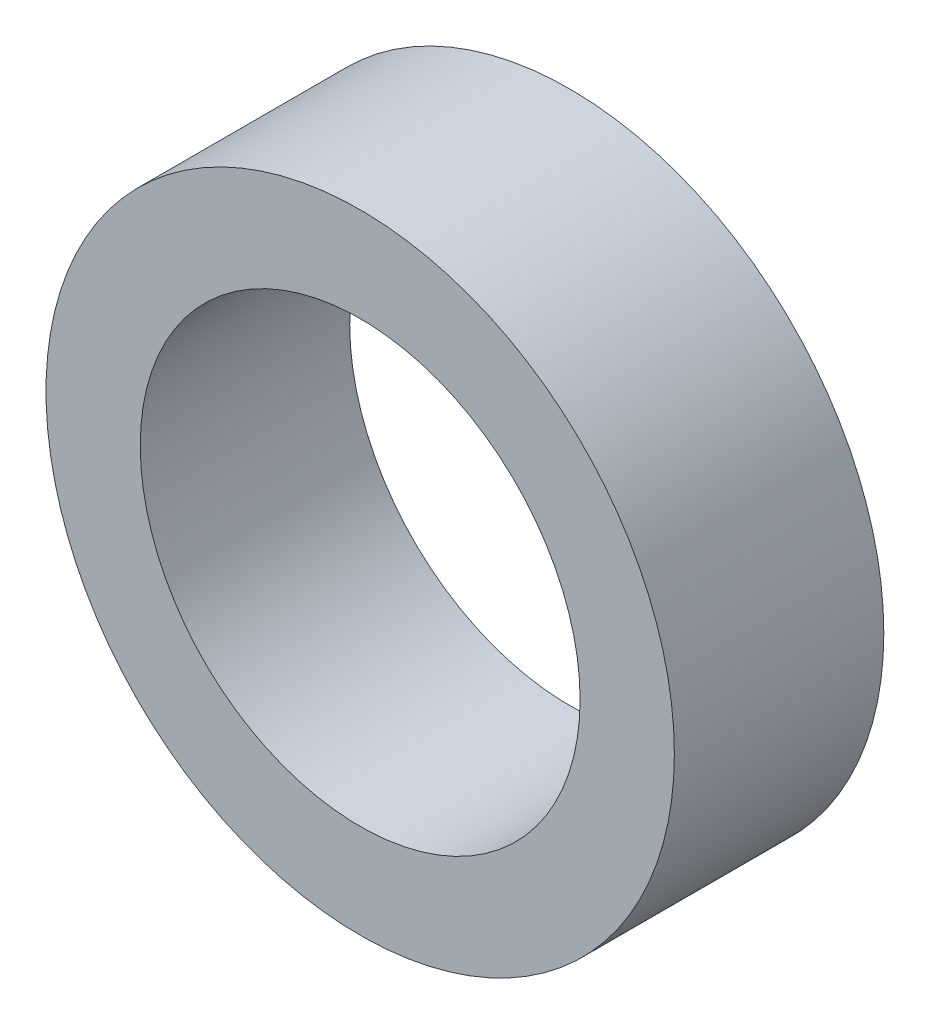
ISO-10303-21;
HEADER;
FILE_DESCRIPTION(('STEP AP214'),'2;1');
FILE_NAME('part.step','',(''),(''),'','','');
FILE_SCHEMA(('AUTOMOTIVE_DESIGN { 1 0 10303 214 1 1 1 1 }'));
ENDSEC;
DATA;
#1=APPLICATION_CONTEXT('core data for automotive mechanical design processes');
#2=APPLICATION_PROTOCOL_DEFINITION('international standard','automotive_design',2000,#1);
#3=PRODUCT_CONTEXT('',#1,'mechanical');
#4=PRODUCT('Part','Part','',(#3));
#5=PRODUCT_RELATED_PRODUCT_CATEGORY('part','',(#4));
#6=PRODUCT_DEFINITION_FORMATION('','',#4);
#7=PRODUCT_DEFINITION_CONTEXT('part definition',#1,'design');
#8=PRODUCT_DEFINITION('design','',#6,#7);
#9=PRODUCT_DEFINITION_SHAPE('','',#8);
#10=(LENGTH_UNIT() NAMED_UNIT(*) SI_UNIT(.MILLI.,.METRE.));
#11=(NAMED_UNIT(*) PLANE_ANGLE_UNIT() SI_UNIT($,.RADIAN.));
#12=(NAMED_UNIT(*) SI_UNIT($,.STERADIAN.) SOLID_ANGLE_UNIT());
#13=UNCERTAINTY_MEASURE_WITH_UNIT(LENGTH_MEASURE(1.E-05),#10,'distance_accuracy_value','');
#14=(GEOMETRIC_REPRESENTATION_CONTEXT(3) GLOBAL_UNCERTAINTY_ASSIGNED_CONTEXT((#13)) GLOBAL_UNIT_ASSIGNED_CONTEXT((#10,
#11,#12)) REPRESENTATION_CONTEXT('',''));
#15=CARTESIAN_POINT('',(0.,0.,0.));
#16=DIRECTION('',(0.,0.,1.));
#17=DIRECTION('',(1.,0.,0.));
#18=AXIS2_PLACEMENT_3D('',#15,#16,#17);
#19=CARTESIAN_POINT('',(0.,0.,2.));
#20=DIRECTION('',(0.,0.,1.));
#21=DIRECTION('',(1.,0.,0.));
#22=AXIS2_PLACEMENT_3D('',#19,#20,#21);
#23=PLANE('',#22);
#24=CARTESIAN_POINT('',(0.,0.,2.));
#25=DIRECTION('',(0.,0.,1.));
#26=DIRECTION('',(1.,0.,0.));
#27=AXIS2_PLACEMENT_3D('',#24,#25,#26);
#28=CIRCLE('',#27,3.);
#29=CARTESIAN_POINT('',(3.,0.,2.));
#30=VERTEX_POINT('',#29);
#31=EDGE_CURVE('E10',#30,#30,#28,.T.);
#32=ORIENTED_EDGE('',*,*,#31,.T.);
#33=EDGE_LOOP('',(#32));
#34=FACE_BOUND('',#33,.T.);
#35=CARTESIAN_POINT('',(0.,0.,2.));
#36=DIRECTION('',(0.,0.,1.));
#37=DIRECTION('',(1.,0.,0.));
#38=AXIS2_PLACEMENT_3D('',#35,#36,#37);
#39=CIRCLE('',#38,2.1);
#40=CARTESIAN_POINT('',(2.1,0.,2.));
#41=VERTEX_POINT('',#40);
#42=EDGE_CURVE('E43',#41,#41,#39,.T.);
#43=ORIENTED_EDGE('',*,*,#42,.F.);
#44=EDGE_LOOP('',(#43));
#45=FACE_BOUND('',#44,.T.);
#46=ADVANCED_FACE('F32',(#34,#45),#23,.T.);
#47=CARTESIAN_POINT('',(0.,0.,0.));
#48=DIRECTION('',(0.,0.,1.));
#49=DIRECTION('',(1.,0.,0.));
#50=AXIS2_PLACEMENT_3D('',#47,#48,#49);
#51=PLANE('',#50);
#52=CARTESIAN_POINT('',(0.,0.,0.));
#53=DIRECTION('',(0.,0.,1.));
#54=DIRECTION('',(1.,0.,0.));
#55=AXIS2_PLACEMENT_3D('',#52,#53,#54);
#56=CIRCLE('',#55,3.);
#57=CARTESIAN_POINT('',(3.,0.,0.));
#58=VERTEX_POINT('',#57);
#59=EDGE_CURVE('E36',#58,#58,#56,.T.);
#60=ORIENTED_EDGE('',*,*,#59,.F.);
#61=EDGE_LOOP('',(#60));
#62=FACE_BOUND('',#61,.T.);
#63=CARTESIAN_POINT('',(0.,0.,0.));
#64=DIRECTION('',(0.,0.,1.));
#65=DIRECTION('',(1.,0.,0.));
#66=AXIS2_PLACEMENT_3D('',#63,#64,#65);
#67=CIRCLE('',#66,2.1);
#68=CARTESIAN_POINT('',(2.1,0.,0.));
#69=VERTEX_POINT('',#68);
#70=EDGE_CURVE('E45',#69,#69,#67,.T.);
#71=ORIENTED_EDGE('',*,*,#70,.T.);
#72=EDGE_LOOP('',(#71));
#73=FACE_BOUND('',#72,.T.);
#74=ADVANCED_FACE('F55',(#62,#73),#51,.F.);
#75=CARTESIAN_POINT('',(0.,0.,2.));
#76=DIRECTION('',(0.,0.,-1.));
#77=DIRECTION('',(-1.,0.,0.));
#78=AXIS2_PLACEMENT_3D('',#75,#76,#77);
#79=CYLINDRICAL_SURFACE('',#78,3.);
#80=ORIENTED_EDGE('',*,*,#31,.F.);
#81=EDGE_LOOP('',(#80));
#82=FACE_BOUND('',#81,.T.);
#83=ORIENTED_EDGE('',*,*,#59,.T.);
#84=EDGE_LOOP('',(#83));
#85=FACE_BOUND('',#84,.T.);
#86=ADVANCED_FACE('F34',(#82,#85),#79,.T.);
#87=CARTESIAN_POINT('',(0.,0.,2.));
#88=DIRECTION('',(0.,0.,-1.));
#89=DIRECTION('',(-1.,0.,0.));
#90=AXIS2_PLACEMENT_3D('',#87,#88,#89);
#91=CYLINDRICAL_SURFACE('',#90,2.1);
#92=ORIENTED_EDGE('',*,*,#42,.T.);
#93=EDGE_LOOP('',(#92));
#94=FACE_BOUND('',#93,.T.);
#95=ORIENTED_EDGE('',*,*,#70,.F.);
#96=EDGE_LOOP('',(#95));
#97=FACE_BOUND('',#96,.T.);
#98=ADVANCED_FACE('F51',(#94,#97),#91,.F.);
#99=CLOSED_SHELL('',(#46,#74,#86,#98));
#100=MANIFOLD_SOLID_BREP('B2',#99);
#101=ADVANCED_BREP_SHAPE_REPRESENTATION('',(#18,#100),#14);
#102=SHAPE_DEFINITION_REPRESENTATION(#9,#101);
ENDSEC;
END-ISO-10303-21;
